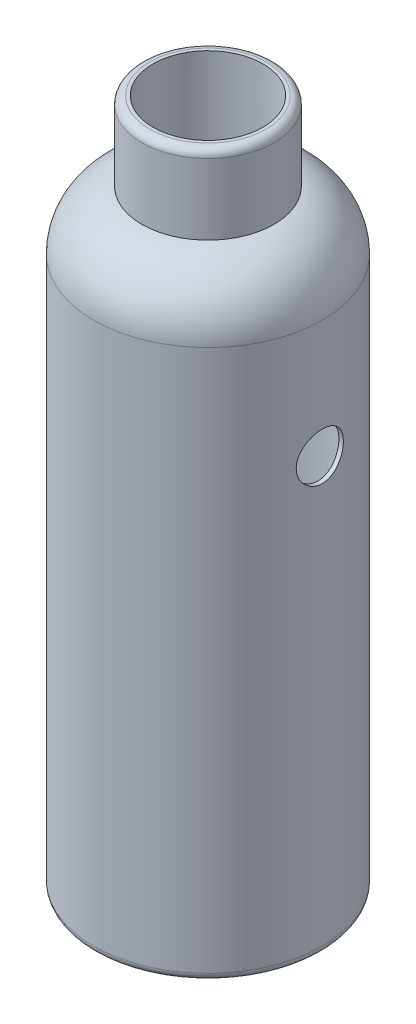
ISO-10303-21;
HEADER;
FILE_DESCRIPTION(('STEP AP214'),'2;1');
FILE_NAME('part.step','',(''),(''),'','','');
FILE_SCHEMA(('AUTOMOTIVE_DESIGN { 1 0 10303 214 1 1 1 1 }'));
ENDSEC;
DATA;
#1=APPLICATION_CONTEXT('core data for automotive mechanical design processes');
#2=APPLICATION_PROTOCOL_DEFINITION('international standard','automotive_design',2000,#1);
#3=PRODUCT_CONTEXT('',#1,'mechanical');
#4=PRODUCT('Part','Part','',(#3));
#5=PRODUCT_RELATED_PRODUCT_CATEGORY('part','',(#4));
#6=PRODUCT_DEFINITION_FORMATION('','',#4);
#7=PRODUCT_DEFINITION_CONTEXT('part definition',#1,'design');
#8=PRODUCT_DEFINITION('design','',#6,#7);
#9=PRODUCT_DEFINITION_SHAPE('','',#8);
#10=(LENGTH_UNIT() NAMED_UNIT(*) SI_UNIT(.MILLI.,.METRE.));
#11=(NAMED_UNIT(*) PLANE_ANGLE_UNIT() SI_UNIT($,.RADIAN.));
#12=(NAMED_UNIT(*) SI_UNIT($,.STERADIAN.) SOLID_ANGLE_UNIT());
#13=UNCERTAINTY_MEASURE_WITH_UNIT(LENGTH_MEASURE(1.E-05),#10,'distance_accuracy_value','');
#14=(GEOMETRIC_REPRESENTATION_CONTEXT(3) GLOBAL_UNCERTAINTY_ASSIGNED_CONTEXT((#13)) GLOBAL_UNIT_ASSIGNED_CONTEXT((#10,
#11,#12)) REPRESENTATION_CONTEXT('',''));
#15=CARTESIAN_POINT('',(0.,0.,0.));
#16=DIRECTION('',(0.,0.,1.));
#17=DIRECTION('',(1.,0.,0.));
#18=AXIS2_PLACEMENT_3D('',#15,#16,#17);
#19=CARTESIAN_POINT('',(0.,171.45,0.));
#20=DIRECTION('',(0.,-1.,0.));
#21=DIRECTION('',(0.,0.,-1.));
#22=AXIS2_PLACEMENT_3D('',#19,#20,#21);
#23=CYLINDRICAL_SURFACE('',#22,36.96335);
#24=CARTESIAN_POINT('',(0.,177.8,0.));
#25=DIRECTION('',(0.,1.,0.));
#26=DIRECTION('',(0.,0.,1.));
#27=AXIS2_PLACEMENT_3D('',#24,#25,#26);
#28=CIRCLE('',#27,36.96335);
#29=CARTESIAN_POINT('',(0.,177.8,36.96335));
#30=VERTEX_POINT('',#29);
#31=EDGE_CURVE('E60',#30,#30,#28,.F.);
#32=ORIENTED_EDGE('',*,*,#31,.T.);
#33=EDGE_LOOP('',(#32));
#34=FACE_BOUND('',#33,.T.);
#35=CARTESIAN_POINT('',(0.,2.53999999999999,0.));
#36=DIRECTION('',(0.,1.,0.));
#37=DIRECTION('',(0.,0.,1.));
#38=AXIS2_PLACEMENT_3D('',#35,#36,#37);
#39=CIRCLE('',#38,36.96335);
#40=CARTESIAN_POINT('',(0.,2.53999999999999,36.96335));
#41=VERTEX_POINT('',#40);
#42=EDGE_CURVE('E89',#41,#41,#39,.T.);
#43=ORIENTED_EDGE('',*,*,#42,.T.);
#44=EDGE_LOOP('',(#43));
#45=FACE_BOUND('',#44,.T.);
#46=CARTESIAN_POINT('',(36.96335,132.08,0.));
#47=CARTESIAN_POINT('',(36.963352305865,132.079995571433,-0.211679694230586));
#48=CARTESIAN_POINT('',(36.9615285466324,132.0888227045,-0.423304774462052));
#49=CARTESIAN_POINT('',(36.9542894645861,132.124051847075,-0.845088147981925));
#50=CARTESIAN_POINT('',(36.948873557214,132.15045671705,-1.05524619691118));
#51=CARTESIAN_POINT('',(36.9345947012524,132.220654137063,-1.4726167469524));
#52=CARTESIAN_POINT('',(36.9257300511885,132.264455269957,-1.67982774171632));
#53=CARTESIAN_POINT('',(36.904797440222,132.369116022692,-2.08981192735579));
#54=CARTESIAN_POINT('',(36.8927283016668,132.429981914311,-2.29258345700828));
#55=CARTESIAN_POINT('',(36.8657406258846,132.568199948135,-2.69191595729348));
#56=CARTESIAN_POINT('',(36.8508260197034,132.645529362686,-2.88848506506365));
#57=CARTESIAN_POINT('',(36.8185395774822,132.816176100357,-3.27443189100768));
#58=CARTESIAN_POINT('',(36.8011668350043,132.909499323889,-3.46380692354248));
#59=CARTESIAN_POINT('',(36.7644496021085,133.111392003192,-3.83393595534274));
#60=CARTESIAN_POINT('',(36.7451059820618,133.219954736885,-4.01469370881079));
#61=CARTESIAN_POINT('',(36.7049567919359,133.451638111737,-4.36655031555331));
#62=CARTESIAN_POINT('',(36.6841506692058,133.574764268254,-4.53764547300001));
#63=CARTESIAN_POINT('',(36.6413801655638,133.836319945789,-4.87104758866114));
#64=CARTESIAN_POINT('',(36.6194045932802,133.974920833495,-5.0332186939354));
#65=CARTESIAN_POINT('',(36.5751359204194,134.265267872421,-5.34542340850403));
#66=CARTESIAN_POINT('',(36.5528426797653,134.417019982652,-5.49545145542683));
#67=CARTESIAN_POINT('',(36.5085665911123,134.732606772109,-5.78228982257317));
#68=CARTESIAN_POINT('',(36.4865837691138,134.896442456374,-5.91909904114372));
#69=CARTESIAN_POINT('',(36.4435562254647,135.235011446827,-6.17848969631476));
#70=CARTESIAN_POINT('',(36.4225110839487,135.409739789785,-6.30107754107174));
#71=CARTESIAN_POINT('',(36.3817372908439,135.770819130733,-6.53240963172599));
#72=CARTESIAN_POINT('',(36.3620242026563,135.95727025002,-6.6410004276127));
#73=CARTESIAN_POINT('',(36.3247361318321,136.338804423867,-6.84202018975111));
#74=CARTESIAN_POINT('',(36.3071603287031,136.533884126488,-6.93445536405774));
#75=CARTESIAN_POINT('',(36.2746543695883,136.931433765533,-7.10253677391986));
#76=CARTESIAN_POINT('',(36.2597250277854,137.13390595323,-7.17817784457703));
#77=CARTESIAN_POINT('',(36.2329739215797,137.544650615105,-7.31201097166313));
#78=CARTESIAN_POINT('',(36.2211509157941,137.752920735345,-7.37020999975553));
#79=CARTESIAN_POINT('',(36.201102035388,138.170966815679,-7.46805980384476));
#80=CARTESIAN_POINT('',(36.1928296916109,138.380684353409,-7.50795069883898));
#81=CARTESIAN_POINT('',(36.1799034090434,138.802758954121,-7.56999599281672));
#82=CARTESIAN_POINT('',(36.1752481136092,139.015114997089,-7.59215704181422));
#83=CARTESIAN_POINT('',(36.1696914555439,139.441005574881,-7.61858559704948));
#84=CARTESIAN_POINT('',(36.1687904235639,139.654540211851,-7.62285152720195));
#85=CARTESIAN_POINT('',(36.1707706162093,140.081195599273,-7.61344990933926));
#86=CARTESIAN_POINT('',(36.1736518069281,140.294316353419,-7.59978252209136));
#87=CARTESIAN_POINT('',(36.1830317286498,140.715121774816,-7.55499629179603));
#88=CARTESIAN_POINT('',(36.1894708220917,140.922838464319,-7.52416508621805));
#89=CARTESIAN_POINT('',(36.2057389977795,141.334963483618,-7.44548982067689));
#90=CARTESIAN_POINT('',(36.2155692539433,141.539370642068,-7.39763986916152));
#91=CARTESIAN_POINT('',(36.2383312106017,141.943314704258,-7.28531897321399));
#92=CARTESIAN_POINT('',(36.2512618999493,142.142853172503,-7.22085344712181));
#93=CARTESIAN_POINT('',(36.2798623993763,142.535841669832,-7.07575386959306));
#94=CARTESIAN_POINT('',(36.2955332297409,142.729289399271,-6.99511379394992));
#95=CARTESIAN_POINT('',(36.3292832908999,143.110012075058,-6.81767008691363));
#96=CARTESIAN_POINT('',(36.3473781267145,143.297236291759,-6.72076059801996));
#97=CARTESIAN_POINT('',(36.3853905877638,143.662940424932,-6.51182524218756));
#98=CARTESIAN_POINT('',(36.4053088415862,143.841417293124,-6.39979415601234));
#99=CARTESIAN_POINT('',(36.4464082290524,144.188374544478,-6.16142763328717));
#100=CARTESIAN_POINT('',(36.4675892751894,144.3568556187,-6.03509318736222));
#101=CARTESIAN_POINT('',(36.5106345034388,144.68273840741,-5.7689665808631));
#102=CARTESIAN_POINT('',(36.5324986943878,144.840139978496,-5.62917424615917));
#103=CARTESIAN_POINT('',(36.576739872546,145.145765723836,-5.33422928329601));
#104=CARTESIAN_POINT('',(36.5991185988651,145.293753515833,-5.17883186289039));
#105=CARTESIAN_POINT('',(36.6433323072458,145.576087016594,-4.85612494645797));
#106=CARTESIAN_POINT('',(36.6651674702819,145.710437312953,-4.68881948867861));
#107=CARTESIAN_POINT('',(36.7076990515941,145.964666299789,-4.34331377554415));
#108=CARTESIAN_POINT('',(36.7283950279206,146.084539395046,-4.16510934772894));
#109=CARTESIAN_POINT('',(36.7680510810867,146.308851915944,-3.79914719300311));
#110=CARTESIAN_POINT('',(36.7870118181048,146.413297220514,-3.61139314193622));
#111=CARTESIAN_POINT('',(36.8227107402634,146.606243237669,-3.22715333462816));
#112=CARTESIAN_POINT('',(36.8394441088194,146.694709539136,-3.03064984364046));
#113=CARTESIAN_POINT('',(36.8701591323886,146.85471578782,-2.63074246955419));
#114=CARTESIAN_POINT('',(36.8841418024484,146.926261980775,-2.42734116445322));
#115=CARTESIAN_POINT('',(36.9089640157106,147.051909830788,-2.015012562268));
#116=CARTESIAN_POINT('',(36.9198033025124,147.106010064847,-1.80608481591681));
#117=CARTESIAN_POINT('',(36.9380245725384,147.196317455727,-1.3842497229082));
#118=CARTESIAN_POINT('',(36.945406612497,147.232524906173,-1.17134244161565));
#119=CARTESIAN_POINT('',(36.9564003485042,147.286261402962,-0.746968126951276));
#120=CARTESIAN_POINT('',(36.9600772276475,147.304113485097,-0.535543635240457));
#121=CARTESIAN_POINT('',(36.9637881598771,147.322130337452,-0.111834971871085));
#122=CARTESIAN_POINT('',(36.963820941936,147.32228893635,0.100449473914229));
#123=CARTESIAN_POINT('',(36.9602402454431,147.304905471858,0.524170780358944));
#124=CARTESIAN_POINT('',(36.9566283057164,147.287370878649,0.735607960914798));
#125=CARTESIAN_POINT('',(36.9458598573688,147.234744839862,1.15627369551296));
#126=CARTESIAN_POINT('',(36.9387020389765,147.199646906716,1.36550140423543));
#127=CARTESIAN_POINT('',(36.9211301115606,147.11261089259,1.77809077501895));
#128=CARTESIAN_POINT('',(36.9107493013978,147.06084482698,1.98149018474644));
#129=CARTESIAN_POINT('',(36.8869884767619,146.940755368956,2.38324024496402));
#130=CARTESIAN_POINT('',(36.8736073753735,146.872425975416,2.58158903669624));
#131=CARTESIAN_POINT('',(36.8442128980976,146.719742743786,2.97178354640628));
#132=CARTESIAN_POINT('',(36.8281998912083,146.635391151781,3.16363017145878));
#133=CARTESIAN_POINT('',(36.7939706559759,146.451267431915,3.53957628616298));
#134=CARTESIAN_POINT('',(36.7757543404414,146.351494693752,3.72367546883713));
#135=CARTESIAN_POINT('',(36.737360091282,146.135851190639,4.08522874080188));
#136=CARTESIAN_POINT('',(36.7171599049891,146.019789553152,4.26256663149082));
#137=CARTESIAN_POINT('',(36.6755511870607,145.773380684941,4.60687142566143));
#138=CARTESIAN_POINT('',(36.654142646965,145.643033354189,4.77383825651347));
#139=CARTESIAN_POINT('',(36.6106987524419,145.368926529652,5.09631815849098));
#140=CARTESIAN_POINT('',(36.588663327841,145.225165530201,5.25182994028919));
#141=CARTESIAN_POINT('',(36.5445705964063,144.925208013297,5.55034894525217));
#142=CARTESIAN_POINT('',(36.522513289896,144.769011677092,5.69335635060737));
#143=CARTESIAN_POINT('',(36.4786235268506,144.442543265155,5.96816163415035));
#144=CARTESIAN_POINT('',(36.4568007571416,144.27208172949,6.09973609472135));
#145=CARTESIAN_POINT('',(36.4143911027815,143.920598760597,6.34800947647873));
#146=CARTESIAN_POINT('',(36.3938037677416,143.739581223695,6.46471383634008));
#147=CARTESIAN_POINT('',(36.354445373317,143.368101958783,6.68249955524734));
#148=CARTESIAN_POINT('',(36.3356749613482,143.177636900676,6.78357535304727));
#149=CARTESIAN_POINT('',(36.3005173522798,142.788721369961,6.9692621385253));
#150=CARTESIAN_POINT('',(36.2841292219219,142.590274063506,7.0538795781762));
#151=CARTESIAN_POINT('',(36.2542912963858,142.187744110631,7.20566184857599));
#152=CARTESIAN_POINT('',(36.2408271298436,141.983694847854,7.27291236199792));
#153=CARTESIAN_POINT('',(36.2171406769159,141.570547056419,7.38996164715036));
#154=CARTESIAN_POINT('',(36.2069171771001,141.361450449317,7.43976695177269));
#155=CARTESIAN_POINT('',(36.1900144993639,140.939643012869,7.52155841477984));
#156=CARTESIAN_POINT('',(36.1833355667087,140.726931934472,7.55354334009641));
#157=CARTESIAN_POINT('',(36.1737276923175,140.299484549272,7.59942235713462));
#158=CARTESIAN_POINT('',(36.1707986935403,140.084748273326,7.61331672403639));
#159=CARTESIAN_POINT('',(36.1688000871534,139.659048561393,7.62280552684672));
#160=CARTESIAN_POINT('',(36.1696563186839,139.448093228755,7.61875160623648));
#161=CARTESIAN_POINT('',(36.1750354209337,139.027217629738,7.59316970556277));
#162=CARTESIAN_POINT('',(36.1795595644802,138.817297748124,7.57163565959844));
#163=CARTESIAN_POINT('',(36.1921400572037,138.400150249136,7.51127078315852));
#164=CARTESIAN_POINT('',(36.2001950681268,138.192921642337,7.47244650586131));
#165=CARTESIAN_POINT('',(36.2196044392257,137.782463372477,7.37779296054628));
#166=CARTESIAN_POINT('',(36.2309600229952,137.579235222359,7.3219573857011));
#167=CARTESIAN_POINT('',(36.2566017106989,137.178865002514,7.19390865321248));
#168=CARTESIAN_POINT('',(36.2708790347766,136.98170668878,7.12174449599648));
#169=CARTESIAN_POINT('',(36.3019787602916,136.594178301651,6.96148256158658));
#170=CARTESIAN_POINT('',(36.3188012519349,136.403808469149,6.87338421963034));
#171=CARTESIAN_POINT('',(36.3545197834538,136.031120302254,6.68188718233762));
#172=CARTESIAN_POINT('',(36.3734159237194,135.848802358272,6.57848774615545));
#173=CARTESIAN_POINT('',(36.412758574028,135.493417232364,6.35711331736388));
#174=CARTESIAN_POINT('',(36.4332051072389,135.320350188742,6.23913810692922));
#175=CARTESIAN_POINT('',(36.4754684836294,134.981555445218,5.9871570440038));
#176=CARTESIAN_POINT('',(36.497303394242,134.816016495924,5.85290037055428));
#177=CARTESIAN_POINT('',(36.5413901650006,134.496794403743,5.57103135429851));
#178=CARTESIAN_POINT('',(36.5636420207452,134.343111135791,5.42341915241331));
#179=CARTESIAN_POINT('',(36.6079546131147,134.048565601184,5.11576577547076));
#180=CARTESIAN_POINT('',(36.6300152653213,133.907708760233,4.95571939319594));
#181=CARTESIAN_POINT('',(36.6733175464771,133.639897877082,4.62438350718101));
#182=CARTESIAN_POINT('',(36.6945594726417,133.512938758313,4.45309814563627));
#183=CARTESIAN_POINT('',(36.7358855374174,133.272352227471,4.09831826246546));
#184=CARTESIAN_POINT('',(36.7559533031213,133.158897377497,3.91470474307383));
#185=CARTESIAN_POINT('',(36.7940826445639,132.947930878589,3.5384278191961));
#186=CARTESIAN_POINT('',(36.8121449584917,132.850413356984,3.34576778205859));
#187=CARTESIAN_POINT('',(36.8457476389856,132.672059169958,2.95279008985208));
#188=CARTESIAN_POINT('',(36.8612894823975,132.591212728679,2.75247700465884));
#189=CARTESIAN_POINT('',(36.8894167725781,132.446778351097,2.34559123408765));
#190=CARTESIAN_POINT('',(36.9020027754258,132.38318716823,2.13901973436738));
#191=CARTESIAN_POINT('',(36.9293583177609,132.246189003972,1.61571585991906));
#192=CARTESIAN_POINT('',(36.9420375975474,132.183955559866,1.29587623195638));
#193=CARTESIAN_POINT('',(36.9590315184121,132.100865195828,0.650647955752249));
#194=CARTESIAN_POINT('',(36.9633464568897,132.08000680478,0.325259505217649));
#195=CARTESIAN_POINT('',(36.96335,132.08,0.));
#196=B_SPLINE_CURVE_WITH_KNOTS('',3,(#46,#47,#48,#49,#50,#51,#52,#53,#54,#55,#56,#57,#58,#59,
#60,#61,#62,#63,#64,#65,#66,#67,#68,#69,#70,#71,#72,#73,#74,#75,#76,#77,#78,#79,#80,#81,#82,#83,
#84,#85,#86,#87,#88,#89,#90,#91,#92,#93,#94,#95,#96,#97,#98,#99,#100,#101,#102,#103,#104,#105,
#106,#107,#108,#109,#110,#111,#112,#113,#114,#115,#116,#117,#118,#119,#120,#121,#122,#123,#124,
#125,#126,#127,#128,#129,#130,#131,#132,#133,#134,#135,#136,#137,#138,#139,#140,#141,#142,#143,
#144,#145,#146,#147,#148,#149,#150,#151,#152,#153,#154,#155,#156,#157,#158,#159,#160,#161,#162,
#163,#164,#165,#166,#167,#168,#169,#170,#171,#172,#173,#174,#175,#176,#177,#178,#179,#180,#181,
#182,#183,#184,#185,#186,#187,#188,#189,#190,#191,#192,#193,#194,#195),.UNSPECIFIED.,.T.,.F.,(4,
2,2,2,2,2,2,2,2,2,2,2,2,2,2,2,2,2,2,2,2,2,2,2,2,2,2,2,2,2,2,2,2,2,2,2,2,2,2,2,2,2,2,2,2,2,2,2,2,
2,2,2,2,2,2,2,2,2,2,2,2,2,2,2,2,2,2,2,2,2,2,2,2,2,4),(0.,0.634753368016072,1.26961005625481,
1.90478035590442,2.54018440512846,3.17471691100157,3.80948401354166,4.44397199792732,
5.07870104527737,5.72132856199586,6.36424880051057,7.00722257366469,7.64990548790905,
8.29912375899259,8.94809200648656,9.59725956359522,10.2461672983613,10.8863023796074,
11.5261972497669,12.1661484765073,12.8060939663006,13.4356245267396,14.0653732306259,
14.6949168326718,15.3246953449128,15.9587427311102,16.5930095217727,17.2272324110975,
17.8614635076479,18.5079613651921,19.1542410178096,19.8007696538893,20.4470512840573,
21.0947085193067,21.7421263097103,22.3895968940876,23.0370568529247,23.6729163423884,
24.3089976130389,24.9448104383666,25.5808582946028,26.2105418979347,26.8404539863244,
27.4702778350474,28.100126615881,28.7380916526498,29.3760611566518,30.0141023581688,
30.6521342617905,31.3006747266761,31.9489773056278,32.5975100473932,33.2457880379551,
33.8908037474137,34.5355776521248,35.1803961659606,35.8252048711819,36.4574369685961,
37.089888555141,37.7221006396564,38.3545473984814,38.9851208440674,39.6157166437267,
40.2463429854583,40.8769787526218,41.5189923790345,42.1609992320208,42.8032764107308,
43.4453181895653,44.0948404057635,44.7441227403717,45.3930232487613,46.0418015822473,
47.0171757595428,47.9925152561656),.UNSPECIFIED.);
#197=CARTESIAN_POINT('',(36.96335,132.08,0.));
#198=VERTEX_POINT('',#197);
#199=EDGE_CURVE('E73',#198,#198,#196,.T.);
#200=ORIENTED_EDGE('',*,*,#199,.F.);
#201=EDGE_LOOP('',(#200));
#202=FACE_BOUND('',#201,.T.);
#203=ADVANCED_FACE('F42',(#34,#45,#202),#23,.T.);
#204=CARTESIAN_POINT('',(0.,171.958,0.));
#205=DIRECTION('',(0.,-1.,0.));
#206=DIRECTION('',(0.,0.,-1.));
#207=AXIS2_PLACEMENT_3D('',#204,#205,#206);
#208=CYLINDRICAL_SURFACE('',#207,35.56);
#209=CARTESIAN_POINT('',(0.,177.8,0.));
#210=DIRECTION('',(0.,-1.,0.));
#211=DIRECTION('',(0.,0.,-1.));
#212=AXIS2_PLACEMENT_3D('',#209,#210,#211);
#213=CIRCLE('',#212,35.56);
#214=CARTESIAN_POINT('',(0.,177.8,-35.56));
#215=VERTEX_POINT('',#214);
#216=EDGE_CURVE('E66',#215,#215,#213,.T.);
#217=ORIENTED_EDGE('',*,*,#216,.F.);
#218=EDGE_LOOP('',(#217));
#219=FACE_BOUND('',#218,.T.);
#220=CARTESIAN_POINT('',(0.,0.508000000000008,0.));
#221=DIRECTION('',(0.,1.,0.));
#222=DIRECTION('',(0.,0.,1.));
#223=AXIS2_PLACEMENT_3D('',#220,#221,#222);
#224=CIRCLE('',#223,35.56);
#225=CARTESIAN_POINT('',(0.,0.508000000000008,35.56));
#226=VERTEX_POINT('',#225);
#227=EDGE_CURVE('E65',#226,#226,#224,.T.);
#228=ORIENTED_EDGE('',*,*,#227,.F.);
#229=EDGE_LOOP('',(#228));
#230=FACE_BOUND('',#229,.T.);
#231=CARTESIAN_POINT('',(34.7339776011905,139.7,7.61999999999999));
#232=CARTESIAN_POINT('',(34.7339748405592,139.488573420938,7.62000474434297));
#233=CARTESIAN_POINT('',(34.735911539175,139.277203893653,7.61119848755288));
#234=CARTESIAN_POINT('',(34.743594345941,138.855934623121,7.57605478530873));
#235=CARTESIAN_POINT('',(34.7493410440632,138.646035112591,7.54971462475628));
#236=CARTESIAN_POINT('',(34.7644797716168,138.229190753805,7.47969373336143));
#237=CARTESIAN_POINT('',(34.7738735072433,138.022247335548,7.43600488605704));
#238=CARTESIAN_POINT('',(34.7960314699956,137.612798675343,7.33161921072208));
#239=CARTESIAN_POINT('',(34.8087969392712,137.410295098873,7.27091611412155));
#240=CARTESIAN_POINT('',(34.8373028922588,137.011510268028,7.13308257664017));
#241=CARTESIAN_POINT('',(34.8530390027086,136.815220355989,7.05597626302394));
#242=CARTESIAN_POINT('',(34.8870526622298,136.429815351821,6.88583188973392));
#243=CARTESIAN_POINT('',(34.9053311493812,136.240702940964,6.79278794648545));
#244=CARTESIAN_POINT('',(34.9439000142839,135.87106722386,6.59150530631687));
#245=CARTESIAN_POINT('',(34.9641895395187,135.690540325678,6.48327303998726));
#246=CARTESIAN_POINT('',(35.0062301996411,135.339104933884,6.25229767853434));
#247=CARTESIAN_POINT('',(35.0279818876644,135.168200125746,6.12954907840137));
#248=CARTESIAN_POINT('',(35.0726568071681,134.834845529242,5.86856985204243));
#249=CARTESIAN_POINT('',(35.0955922633621,134.672549659394,5.73014467707557));
#250=CARTESIAN_POINT('',(35.1417144465293,134.360075848034,5.44013491391337));
#251=CARTESIAN_POINT('',(35.1649012832634,134.209903463403,5.28854435661704));
#252=CARTESIAN_POINT('',(35.2108740774999,133.922756231083,4.9732606717355));
#253=CARTESIAN_POINT('',(35.2336600032762,133.78578242406,4.80956659162153));
#254=CARTESIAN_POINT('',(35.2781883355924,133.52604334816,4.47125470005719));
#255=CARTESIAN_POINT('',(35.2999312102501,133.403271669829,4.29664187150869));
#256=CARTESIAN_POINT('',(35.342003591514,133.171512773294,3.93569989310303));
#257=CARTESIAN_POINT('',(35.3623158071617,133.062684295075,3.74926674310909));
#258=CARTESIAN_POINT('',(35.4006883065756,132.861190475575,3.36773043338269));
#259=CARTESIAN_POINT('',(35.4187494563567,132.768518913008,3.1726306472461));
#260=CARTESIAN_POINT('',(35.4521192823778,132.59997241032,2.77500453499058));
#261=CARTESIAN_POINT('',(35.4674271126425,132.524102631007,2.57247594925855));
#262=CARTESIAN_POINT('',(35.4948379144093,132.389826205077,2.16158596867104));
#263=CARTESIAN_POINT('',(35.5069421711172,132.331412554212,1.95322695006943));
#264=CARTESIAN_POINT('',(35.5274517855911,132.233213326309,1.53522325144428));
#265=CARTESIAN_POINT('',(35.5359088670414,132.193166713816,1.32564241843643));
#266=CARTESIAN_POINT('',(35.5491379391554,132.130790057358,0.903824013243305));
#267=CARTESIAN_POINT('',(35.5539113150018,132.108453353855,0.691587470221662));
#268=CARTESIAN_POINT('',(35.559642821628,132.081655721438,0.265918696309676));
#269=CARTESIAN_POINT('',(35.5606006189176,132.077196355044,0.0524863625370755));
#270=CARTESIAN_POINT('',(35.5586727233026,132.086195074628,-0.373981735131165));
#271=CARTESIAN_POINT('',(35.5557870649518,132.099652999524,-0.587017502574809));
#272=CARTESIAN_POINT('',(35.5463335717759,132.144003137756,-1.00761508283507));
#273=CARTESIAN_POINT('',(35.53982742486,132.174603328613,-1.21520915629251));
#274=CARTESIAN_POINT('',(35.5233531966381,132.252793689856,-1.62710679422538));
#275=CARTESIAN_POINT('',(35.5133839172104,132.30038974037,-1.83140919426823));
#276=CARTESIAN_POINT('',(35.4902597175457,132.412179940001,-2.23516068839963));
#277=CARTESIAN_POINT('',(35.4771058563629,132.476368571622,-2.43461137174363));
#278=CARTESIAN_POINT('',(35.4479615301771,132.620890999263,-2.82744300123553));
#279=CARTESIAN_POINT('',(35.4319700088183,132.701230809253,-3.02082165533058));
#280=CARTESIAN_POINT('',(35.3974681837783,132.878041461549,-3.40141214661453));
#281=CARTESIAN_POINT('',(35.3789417064679,132.974616877535,-3.58857392588548));
#282=CARTESIAN_POINT('',(35.3399476004349,133.182856747237,-3.95417724378021));
#283=CARTESIAN_POINT('',(35.3194793024389,133.294526409054,-4.13261574346902));
#284=CARTESIAN_POINT('',(35.2771595158106,133.532144183109,-4.47952612730955));
#285=CARTESIAN_POINT('',(35.2553081127379,133.65809141251,-4.64799862671744));
#286=CARTESIAN_POINT('',(35.2108077655562,133.923419387529,-4.9738989527868));
#287=CARTESIAN_POINT('',(35.1881588100136,134.062800325783,-5.13132662101174));
#288=CARTESIAN_POINT('',(35.1422130506564,134.357016878314,-5.43717391947518));
#289=CARTESIAN_POINT('',(35.1189123961349,134.512107588414,-5.5853476877156));
#290=CARTESIAN_POINT('',(35.0727777559854,134.834208190621,-5.86808121326542));
#291=CARTESIAN_POINT('',(35.0499436160662,135.001214057147,-6.00264553177985));
#292=CARTESIAN_POINT('',(35.0053719793077,135.346137541407,-6.25733639831589));
#293=CARTESIAN_POINT('',(34.9836349198727,135.524059449682,-6.37745721371244));
#294=CARTESIAN_POINT('',(34.9418991673334,135.889482174612,-6.60229943347416));
#295=CARTESIAN_POINT('',(34.9218998128285,136.076979303245,-6.70702670747978));
#296=CARTESIAN_POINT('',(34.8841528753718,136.460937032021,-6.90066994654408));
#297=CARTESIAN_POINT('',(34.8664125888833,136.657424022822,-6.98953503260883));
#298=CARTESIAN_POINT('',(34.833792083198,137.057355547436,-7.15033302449804));
#299=CARTESIAN_POINT('',(34.8189108037947,137.260797469055,-7.22227220919158));
#300=CARTESIAN_POINT('',(34.7924490991892,137.673261695886,-7.34869112402216));
#301=CARTESIAN_POINT('',(34.780868884059,137.882284355318,-7.40316974303746));
#302=CARTESIAN_POINT('',(34.7613660306907,138.304362732782,-7.49421133766492));
#303=CARTESIAN_POINT('',(34.7534433239837,138.517418375239,-7.53077464865435));
#304=CARTESIAN_POINT('',(34.7416189186641,138.941732849553,-7.58513499041118));
#305=CARTESIAN_POINT('',(34.7376408056795,139.152943902954,-7.60328881279313));
#306=CARTESIAN_POINT('',(34.7335530182392,139.576257083317,-7.62194119163468));
#307=CARTESIAN_POINT('',(34.7334446923309,139.788359495149,-7.62243359342464));
#308=CARTESIAN_POINT('',(34.7371024647475,140.211742421553,-7.6057467869457));
#309=CARTESIAN_POINT('',(34.7408669040474,140.423023249174,-7.5885751456457));
#310=CARTESIAN_POINT('',(34.7521567288913,140.843399437937,-7.53670390496975));
#311=CARTESIAN_POINT('',(34.7596835048691,141.052493961907,-7.50199782540159));
#312=CARTESIAN_POINT('',(34.7781652541976,141.464494282841,-7.4158435178257));
#313=CARTESIAN_POINT('',(34.7890791915545,141.667443827301,-7.36459541610791));
#314=CARTESIAN_POINT('',(34.81405139936,142.068336155334,-7.24562744147216));
#315=CARTESIAN_POINT('',(34.8281108071853,142.266277098946,-7.17790160956363));
#316=CARTESIAN_POINT('',(34.8589695185587,142.655712044854,-7.02650742061891));
#317=CARTESIAN_POINT('',(34.8757684687817,142.847206874683,-6.94284111922744));
#318=CARTESIAN_POINT('',(34.9116374168006,143.222517274936,-6.76016511182205));
#319=CARTESIAN_POINT('',(34.9307075094657,143.406332524137,-6.66115476481051));
#320=CARTESIAN_POINT('',(34.9708877642823,143.767741627653,-6.44691071410753));
#321=CARTESIAN_POINT('',(34.9920239503117,143.945203079489,-6.33145852023191));
#322=CARTESIAN_POINT('',(35.0355014163815,144.289812991894,-6.08627440564554));
#323=CARTESIAN_POINT('',(35.0578427060602,144.456961369956,-5.95654237071719));
#324=CARTESIAN_POINT('',(35.1031154191717,144.779869674253,-5.6836618804217));
#325=CARTESIAN_POINT('',(35.1260469110187,144.935628272115,-5.54051186456447));
#326=CARTESIAN_POINT('',(35.1718689668363,145.234709548299,-5.24176170060401));
#327=CARTESIAN_POINT('',(35.1947595313951,145.378032406755,-5.08616173290276));
#328=CARTESIAN_POINT('',(35.2402844826533,145.653761581443,-4.76061353233401));
#329=CARTESIAN_POINT('',(35.2629067775943,145.785924011341,-4.59045692795719));
#330=CARTESIAN_POINT('',(35.3068175377795,146.035395964562,-4.23951532920945));
#331=CARTESIAN_POINT('',(35.3281064891676,146.152710917465,-4.05873425572511));
#332=CARTESIAN_POINT('',(35.368766286461,146.371732697794,-3.68765714900782));
#333=CARTESIAN_POINT('',(35.3881364535229,146.473434008243,-3.49735778389462));
#334=CARTESIAN_POINT('',(35.424393326622,146.660377329479,-3.10870202116115));
#335=CARTESIAN_POINT('',(35.4412810095177,146.74562581861,-2.91034883214772));
#336=CARTESIAN_POINT('',(35.4720088848729,146.898597003256,-2.50811200352209));
#337=CARTESIAN_POINT('',(35.4858664710188,146.9664201413,-2.30426790198227));
#338=CARTESIAN_POINT('',(35.5102613477292,147.084633242444,-1.89147217029623));
#339=CARTESIAN_POINT('',(35.5207998843085,147.135029748428,-1.68252248867274));
#340=CARTESIAN_POINT('',(35.5382626246819,147.218015581503,-1.26095086123416));
#341=CARTESIAN_POINT('',(35.5451865737097,147.250603653413,-1.04832865766017));
#342=CARTESIAN_POINT('',(35.555219427342,147.297694386773,-0.62100249155921));
#343=CARTESIAN_POINT('',(35.5583283911894,147.312197329066,-0.406298561411557));
#344=CARTESIAN_POINT('',(35.5606185484792,147.322887636721,0.0192523481972831));
#345=CARTESIAN_POINT('',(35.5598776216467,147.319438160597,0.230089873790791));
#346=CARTESIAN_POINT('',(35.5546670554091,147.295083344367,0.650782069085339));
#347=CARTESIAN_POINT('',(35.5501961224879,147.274171948699,0.860636372426743));
#348=CARTESIAN_POINT('',(35.5376502664912,147.215066077714,1.27770312079087));
#349=CARTESIAN_POINT('',(35.5295767340327,147.176878271077,1.48491655348581));
#350=CARTESIAN_POINT('',(35.5100452575098,147.083508423065,1.89539516393831));
#351=CARTESIAN_POINT('',(35.4985860589703,147.028320082237,2.09865884840896));
#352=CARTESIAN_POINT('',(35.4726404951617,146.90158696017,2.49910166996573));
#353=CARTESIAN_POINT('',(35.4581639298418,146.830095061351,2.69629818950751));
#354=CARTESIAN_POINT('',(35.4265529185366,146.671191499569,3.0839541689048));
#355=CARTESIAN_POINT('',(35.4094183775604,146.583779267625,3.27441338768311));
#356=CARTESIAN_POINT('',(35.3729511750504,146.393666715863,3.64733209781487));
#357=CARTESIAN_POINT('',(35.3536184047873,146.290965639748,3.82979119284569));
#358=CARTESIAN_POINT('',(35.3132713852366,146.070998431905,4.18551213299489));
#359=CARTESIAN_POINT('',(35.2922571101336,145.95373207655,4.35877383684284));
#360=CARTESIAN_POINT('',(35.2487104043116,145.703155893348,4.69806401631569));
#361=CARTESIAN_POINT('',(35.2261572214904,145.569591626344,4.86390196745043));
#362=CARTESIAN_POINT('',(35.1805078251034,145.289103019196,5.18378020408911));
#363=CARTESIAN_POINT('',(35.1574116165537,145.142178802424,5.33782059851283));
#364=CARTESIAN_POINT('',(35.1113034320319,144.835888817714,5.63314496663117));
#365=CARTESIAN_POINT('',(35.08829149639,144.676517746047,5.77442344643818));
#366=CARTESIAN_POINT('',(35.0430100476972,144.346509650382,6.04314583548437));
#367=CARTESIAN_POINT('',(35.0207402667255,144.175876759727,6.17059477556482));
#368=CARTESIAN_POINT('',(34.9772757277637,143.822114177027,6.41241597623475));
#369=CARTESIAN_POINT('',(34.9560989180055,143.638849847836,6.52659462819449));
#370=CARTESIAN_POINT('',(34.9157658068594,143.263195215402,6.7390346396908));
#371=CARTESIAN_POINT('',(34.8966087621902,143.070808307356,6.83730186187838));
#372=CARTESIAN_POINT('',(34.8608841915436,142.678287945715,7.01717672080512));
#373=CARTESIAN_POINT('',(34.8443152006638,142.47815895496,7.09879379000877));
#374=CARTESIAN_POINT('',(34.8142543996272,142.071551594033,7.24477903034407));
#375=CARTESIAN_POINT('',(34.8007620267702,141.865074392774,7.30915035602583));
#376=CARTESIAN_POINT('',(34.7711217027322,141.337810357356,7.44918224915598));
#377=CARTESIAN_POINT('',(34.7572743442973,141.01370737168,7.51314502204836));
#378=CARTESIAN_POINT('',(34.7387046514647,140.359689816447,7.59854924230206));
#379=CARTESIAN_POINT('',(34.733981907123,140.029775508649,7.61999259994592));
#380=CARTESIAN_POINT('',(34.7339776011905,139.7,7.61999999999999));
#381=B_SPLINE_CURVE_WITH_KNOTS('',3,(#231,#232,#233,#234,#235,#236,#237,#238,#239,#240,#241,
#242,#243,#244,#245,#246,#247,#248,#249,#250,#251,#252,#253,#254,#255,#256,#257,#258,#259,#260,
#261,#262,#263,#264,#265,#266,#267,#268,#269,#270,#271,#272,#273,#274,#275,#276,#277,#278,#279,
#280,#281,#282,#283,#284,#285,#286,#287,#288,#289,#290,#291,#292,#293,#294,#295,#296,#297,#298,
#299,#300,#301,#302,#303,#304,#305,#306,#307,#308,#309,#310,#311,#312,#313,#314,#315,#316,#317,
#318,#319,#320,#321,#322,#323,#324,#325,#326,#327,#328,#329,#330,#331,#332,#333,#334,#335,#336,
#337,#338,#339,#340,#341,#342,#343,#344,#345,#346,#347,#348,#349,#350,#351,#352,#353,#354,#355,
#356,#357,#358,#359,#360,#361,#362,#363,#364,#365,#366,#367,#368,#369,#370,#371,#372,#373,#374,
#375,#376,#377,#378,#379,#380),.UNSPECIFIED.,.T.,.F.,(4,2,2,2,2,2,2,2,2,2,2,2,2,2,2,2,2,2,2,2,2,
2,2,2,2,2,2,2,2,2,2,2,2,2,2,2,2,2,2,2,2,2,2,2,2,2,2,2,2,2,2,2,2,2,2,2,2,2,2,2,2,2,2,2,2,2,2,2,2,
2,2,2,2,2,4),(0.,0.633989491145163,1.26807717744449,1.90246186740826,2.53708059202505,
3.17077224024913,3.8046983298132,4.43835682641287,5.07225639973238,5.71512856098136,
6.358293733436,7.001509575992,7.6444339918066,8.29412748210398,8.94357025010178,
9.59321222400154,10.2425931788763,10.8824349391752,11.5220359825649,12.161692927286,
12.8013441213447,13.4304162845406,14.0597063016302,14.6887873308172,15.3181030367167,
15.951639430939,16.5853949804635,17.2191113638418,17.8528368359335,18.4993496563843,
19.1456450750838,19.7921961675324,20.438500083428,21.0868411991675,21.7349414243314,
22.3830828838603,23.0312122096196,23.6665252820603,24.30205974689,24.9373220731374,
25.5728193448386,26.2008996814431,26.8292074949193,27.4574343381017,28.0856874325426,
28.7232420631873,29.3608017936964,29.9984357636148,30.6360604957779,31.2852002109004,
31.934101851767,32.5832322525898,33.232106532621,33.8771521461391,34.5219553116105,
35.1668039185035,35.8116425114152,36.4434880373095,37.0755527699014,37.7073737339005,
38.3394290978184,38.9694627665838,39.5995189567467,40.2296063244323,40.8597033673592,
41.5013373497022,42.1429654075082,42.7848683769314,43.4265370496747,44.0766284888235,
44.7264798505633,45.3759620369072,46.0253253402863,47.014243581424,48.0031173921282),.UNSPECIFIED.);
#382=CARTESIAN_POINT('',(34.7339776011905,139.7,7.61999999999999));
#383=VERTEX_POINT('',#382);
#384=EDGE_CURVE('E46',#383,#383,#381,.T.);
#385=ORIENTED_EDGE('',*,*,#384,.T.);
#386=EDGE_LOOP('',(#385));
#387=FACE_BOUND('',#386,.T.);
#388=ADVANCED_FACE('F125',(#219,#230,#387),#208,.F.);
#389=CARTESIAN_POINT('',(0.,0.,0.));
#390=DIRECTION('',(0.,1.,0.));
#391=DIRECTION('',(0.,0.,1.));
#392=AXIS2_PLACEMENT_3D('',#389,#390,#391);
#393=PLANE('',#392);
#394=CARTESIAN_POINT('',(0.,0.,0.));
#395=DIRECTION('',(0.,1.,0.));
#396=DIRECTION('',(0.,0.,1.));
#397=AXIS2_PLACEMENT_3D('',#394,#395,#396);
#398=CIRCLE('',#397,34.42335);
#399=CARTESIAN_POINT('',(0.,0.,34.42335));
#400=VERTEX_POINT('',#399);
#401=EDGE_CURVE('E92',#400,#400,#398,.F.);
#402=ORIENTED_EDGE('',*,*,#401,.T.);
#403=EDGE_LOOP('',(#402));
#404=FACE_BOUND('',#403,.T.);
#405=ADVANCED_FACE('F129',(#404),#393,.F.);
#406=CARTESIAN_POINT('',(0.,2.53999999999999,0.));
#407=DIRECTION('',(0.,1.,0.));
#408=DIRECTION('',(0.,0.,1.));
#409=AXIS2_PLACEMENT_3D('',#406,#407,#408);
#410=TOROIDAL_SURFACE('',#409,34.42335,2.54);
#411=ORIENTED_EDGE('',*,*,#401,.F.);
#412=EDGE_LOOP('',(#411));
#413=FACE_BOUND('',#412,.T.);
#414=ORIENTED_EDGE('',*,*,#42,.F.);
#415=EDGE_LOOP('',(#414));
#416=FACE_BOUND('',#415,.T.);
#417=ADVANCED_FACE('F106',(#413,#416),#410,.T.);
#418=CARTESIAN_POINT('',(0.,177.8,0.));
#419=DIRECTION('',(0.,1.,0.));
#420=DIRECTION('',(0.,0.,1.));
#421=AXIS2_PLACEMENT_3D('',#418,#419,#420);
#422=DEGENERATE_TOROIDAL_SURFACE('',#421,17.91335,19.05,.T.);
#423=ORIENTED_EDGE('',*,*,#31,.F.);
#424=EDGE_LOOP('',(#423));
#425=FACE_BOUND('',#424,.T.);
#426=CARTESIAN_POINT('',(0.,196.85,0.));
#427=DIRECTION('',(0.,1.,0.));
#428=DIRECTION('',(0.,0.,1.));
#429=AXIS2_PLACEMENT_3D('',#426,#427,#428);
#430=CIRCLE('',#429,17.91335);
#431=CARTESIAN_POINT('',(0.,196.85,17.91335));
#432=VERTEX_POINT('',#431);
#433=EDGE_CURVE('E95',#432,#432,#430,.T.);
#434=ORIENTED_EDGE('',*,*,#433,.F.);
#435=EDGE_LOOP('',(#434));
#436=FACE_BOUND('',#435,.T.);
#437=ADVANCED_FACE('F102',(#425,#436),#422,.T.);
#438=CARTESIAN_POINT('',(0.,222.25,0.));
#439=DIRECTION('',(0.,-1.,0.));
#440=DIRECTION('',(0.,0.,-1.));
#441=AXIS2_PLACEMENT_3D('',#438,#439,#440);
#442=CYLINDRICAL_SURFACE('',#441,21.36775);
#443=CARTESIAN_POINT('',(0.,219.71,0.));
#444=DIRECTION('',(0.,1.,0.));
#445=DIRECTION('',(0.,0.,1.));
#446=AXIS2_PLACEMENT_3D('',#443,#444,#445);
#447=CIRCLE('',#446,21.36775);
#448=CARTESIAN_POINT('',(0.,219.71,21.36775));
#449=VERTEX_POINT('',#448);
#450=EDGE_CURVE('E10',#449,#449,#447,.F.);
#451=ORIENTED_EDGE('',*,*,#450,.T.);
#452=EDGE_LOOP('',(#451));
#453=FACE_BOUND('',#452,.T.);
#454=CARTESIAN_POINT('',(0.,196.85,0.));
#455=DIRECTION('',(0.,1.,0.));
#456=DIRECTION('',(0.,0.,1.));
#457=AXIS2_PLACEMENT_3D('',#454,#455,#456);
#458=CIRCLE('',#457,21.36775);
#459=CARTESIAN_POINT('',(0.,196.85,21.36775));
#460=VERTEX_POINT('',#459);
#461=EDGE_CURVE('E86',#460,#460,#458,.T.);
#462=ORIENTED_EDGE('',*,*,#461,.T.);
#463=EDGE_LOOP('',(#462));
#464=FACE_BOUND('',#463,.T.);
#465=ADVANCED_FACE('F105',(#453,#464),#442,.T.);
#466=CARTESIAN_POINT('',(0.,222.25,0.));
#467=DIRECTION('',(0.,1.,0.));
#468=DIRECTION('',(0.,0.,1.));
#469=AXIS2_PLACEMENT_3D('',#466,#467,#468);
#470=PLANE('',#469);
#471=CARTESIAN_POINT('',(0.,222.25,0.));
#472=DIRECTION('',(0.,1.,0.));
#473=DIRECTION('',(0.,0.,1.));
#474=AXIS2_PLACEMENT_3D('',#471,#472,#473);
#475=CIRCLE('',#474,17.78);
#476=CARTESIAN_POINT('',(0.,222.25,17.78));
#477=VERTEX_POINT('',#476);
#478=EDGE_CURVE('E70',#477,#477,#475,.T.);
#479=ORIENTED_EDGE('',*,*,#478,.F.);
#480=EDGE_LOOP('',(#479));
#481=FACE_BOUND('',#480,.T.);
#482=CARTESIAN_POINT('',(0.,222.25,0.));
#483=DIRECTION('',(0.,1.,0.));
#484=DIRECTION('',(0.,0.,1.));
#485=AXIS2_PLACEMENT_3D('',#482,#483,#484);
#486=CIRCLE('',#485,18.82775);
#487=CARTESIAN_POINT('',(0.,222.25,18.82775));
#488=VERTEX_POINT('',#487);
#489=EDGE_CURVE('E55',#488,#488,#486,.T.);
#490=ORIENTED_EDGE('',*,*,#489,.T.);
#491=EDGE_LOOP('',(#490));
#492=FACE_BOUND('',#491,.T.);
#493=ADVANCED_FACE('F112',(#481,#492),#470,.T.);
#494=CARTESIAN_POINT('',(0.,196.85,0.));
#495=DIRECTION('',(0.,1.,0.));
#496=DIRECTION('',(0.,0.,1.));
#497=AXIS2_PLACEMENT_3D('',#494,#495,#496);
#498=PLANE('',#497);
#499=ORIENTED_EDGE('',*,*,#433,.T.);
#500=EDGE_LOOP('',(#499));
#501=FACE_BOUND('',#500,.T.);
#502=ORIENTED_EDGE('',*,*,#461,.F.);
#503=EDGE_LOOP('',(#502));
#504=FACE_BOUND('',#503,.T.);
#505=ADVANCED_FACE('F109',(#501,#504),#498,.F.);
#506=CARTESIAN_POINT('',(0.,219.71,0.));
#507=DIRECTION('',(0.,1.,0.));
#508=DIRECTION('',(0.,0.,1.));
#509=AXIS2_PLACEMENT_3D('',#506,#507,#508);
#510=TOROIDAL_SURFACE('',#509,18.82775,2.54);
#511=ORIENTED_EDGE('',*,*,#450,.F.);
#512=EDGE_LOOP('',(#511));
#513=FACE_BOUND('',#512,.T.);
#514=ORIENTED_EDGE('',*,*,#489,.F.);
#515=EDGE_LOOP('',(#514));
#516=FACE_BOUND('',#515,.T.);
#517=ADVANCED_FACE('F44',(#513,#516),#510,.T.);
#518=CARTESIAN_POINT('',(0.,0.508000000000008,0.));
#519=DIRECTION('',(0.,1.,0.));
#520=DIRECTION('',(0.,0.,1.));
#521=AXIS2_PLACEMENT_3D('',#518,#519,#520);
#522=CYLINDRICAL_SURFACE('',#521,17.78);
#523=CARTESIAN_POINT('',(0.,196.807619524812,0.));
#524=DIRECTION('',(0.,-1.,0.));
#525=DIRECTION('',(0.,0.,-1.));
#526=AXIS2_PLACEMENT_3D('',#523,#524,#525);
#527=CIRCLE('',#526,17.78);
#528=CARTESIAN_POINT('',(0.,196.807619524812,17.78));
#529=VERTEX_POINT('',#528);
#530=EDGE_CURVE('E63',#529,#529,#527,.T.);
#531=CARTESIAN_POINT('',(0.,196.807619524812,17.78));
#532=CARTESIAN_POINT('',(0.,197.072644321428,17.78));
#533=CARTESIAN_POINT('',(0.,197.337669118045,17.78));
#534=CARTESIAN_POINT('',(0.,197.867718711278,17.78));
#535=CARTESIAN_POINT('',(0.,198.132743507894,17.78));
#536=CARTESIAN_POINT('',(0.,198.662793101127,17.78));
#537=CARTESIAN_POINT('',(0.,198.927817897744,17.78));
#538=CARTESIAN_POINT('',(0.,199.457867490977,17.78));
#539=CARTESIAN_POINT('',(0.,199.722892287594,17.78));
#540=CARTESIAN_POINT('',(0.,200.252941880827,17.78));
#541=CARTESIAN_POINT('',(0.,200.517966677443,17.78));
#542=CARTESIAN_POINT('',(0.,201.048016270676,17.78));
#543=CARTESIAN_POINT('',(0.,201.313041067293,17.78));
#544=CARTESIAN_POINT('',(0.,201.843090660526,17.78));
#545=CARTESIAN_POINT('',(0.,202.108115457143,17.78));
#546=CARTESIAN_POINT('',(0.,202.638165050376,17.78));
#547=CARTESIAN_POINT('',(0.,202.903189846992,17.78));
#548=CARTESIAN_POINT('',(0.,203.433239440225,17.78));
#549=CARTESIAN_POINT('',(0.,203.698264236842,17.78));
#550=CARTESIAN_POINT('',(0.,204.228313830075,17.78));
#551=CARTESIAN_POINT('',(0.,204.493338626691,17.78));
#552=CARTESIAN_POINT('',(0.,205.023388219925,17.78));
#553=CARTESIAN_POINT('',(0.,205.288413016541,17.78));
#554=CARTESIAN_POINT('',(0.,205.818462609774,17.78));
#555=CARTESIAN_POINT('',(0.,206.083487406391,17.78));
#556=CARTESIAN_POINT('',(0.,206.613536999624,17.78));
#557=CARTESIAN_POINT('',(0.,206.87856179624,17.78));
#558=CARTESIAN_POINT('',(0.,207.408611389473,17.78));
#559=CARTESIAN_POINT('',(0.,207.67363618609,17.78));
#560=CARTESIAN_POINT('',(0.,208.203685779323,17.78));
#561=CARTESIAN_POINT('',(0.,208.46871057594,17.78));
#562=CARTESIAN_POINT('',(0.,208.998760169173,17.78));
#563=CARTESIAN_POINT('',(0.,209.263784965789,17.78));
#564=CARTESIAN_POINT('',(0.,209.793834559022,17.78));
#565=CARTESIAN_POINT('',(0.,210.058859355639,17.78));
#566=CARTESIAN_POINT('',(0.,210.588908948872,17.78));
#567=CARTESIAN_POINT('',(0.,210.853933745489,17.78));
#568=CARTESIAN_POINT('',(0.,211.383983338722,17.78));
#569=CARTESIAN_POINT('',(0.,211.649008135338,17.78));
#570=CARTESIAN_POINT('',(0.,212.179057728571,17.78));
#571=CARTESIAN_POINT('',(0.,212.444082525188,17.78));
#572=CARTESIAN_POINT('',(0.,212.974132118421,17.78));
#573=CARTESIAN_POINT('',(0.,213.239156915037,17.78));
#574=CARTESIAN_POINT('',(0.,213.769206508271,17.78));
#575=CARTESIAN_POINT('',(0.,214.034231304887,17.78));
#576=CARTESIAN_POINT('',(0.,214.56428089812,17.78));
#577=CARTESIAN_POINT('',(0.,214.829305694737,17.78));
#578=CARTESIAN_POINT('',(0.,215.35935528797,17.78));
#579=CARTESIAN_POINT('',(0.,215.624380084586,17.78));
#580=CARTESIAN_POINT('',(0.,216.154429677819,17.78));
#581=CARTESIAN_POINT('',(0.,216.419454474436,17.78));
#582=CARTESIAN_POINT('',(0.,216.949504067669,17.78));
#583=CARTESIAN_POINT('',(0.,217.214528864286,17.78));
#584=CARTESIAN_POINT('',(0.,217.744578457519,17.78));
#585=CARTESIAN_POINT('',(0.,218.009603254135,17.78));
#586=CARTESIAN_POINT('',(0.,218.539652847368,17.78));
#587=CARTESIAN_POINT('',(0.,218.804677643985,17.78));
#588=CARTESIAN_POINT('',(0.,219.334727237218,17.78));
#589=CARTESIAN_POINT('',(0.,219.599752033835,17.78));
#590=CARTESIAN_POINT('',(0.,220.129801627068,17.78));
#591=CARTESIAN_POINT('',(0.,220.394826423684,17.78));
#592=CARTESIAN_POINT('',(0.,220.924876016917,17.78));
#593=CARTESIAN_POINT('',(0.,221.189900813534,17.78));
#594=CARTESIAN_POINT('',(0.,221.719950406767,17.78));
#595=CARTESIAN_POINT('',(0.,221.984975203383,17.78));
#596=CARTESIAN_POINT('',(0.,222.25,17.78));
#597=B_SPLINE_CURVE_WITH_KNOTS('',3,(#531,#532,#533,#534,#535,#536,#537,#538,#539,#540,#541,
#542,#543,#544,#545,#546,#547,#548,#549,#550,#551,#552,#553,#554,#555,#556,#557,#558,#559,#560,
#561,#562,#563,#564,#565,#566,#567,#568,#569,#570,#571,#572,#573,#574,#575,#576,#577,#578,#579,
#580,#581,#582,#583,#584,#585,#586,#587,#588,#589,#590,#591,#592,#593,#594,#595,#596),
.UNSPECIFIED.,.F.,.F.,(4,2,2,2,2,2,2,2,2,2,2,2,2,2,2,2,2,2,2,2,2,2,2,2,2,2,2,2,2,2,2,2,4),(0.,
0.795074389849632,1.59014877969926,2.38522316954889,3.18029755939853,3.97537194924819,
4.77044633909782,5.56552072894745,6.36059511879708,7.15566950864671,7.95074389849634,
8.74581828834597,9.54089267819563,10.3359670680453,11.1310414578949,11.9261158477445,
12.7211902375942,13.5162646274438,14.3113390172934,15.1064134071431,15.9014877969927,
16.6965621868423,17.491636576692,18.2867109665416,19.0817853563912,19.8768597462409,
20.6719341360905,21.4670085259401,22.2620829157898,23.0571573056394,23.8522316954891,
24.6473060853387,25.4423804751883),.UNSPECIFIED.);
#598=EDGE_CURVE('BSEAM160',#529,#477,#597,.T.);
#599=ORIENTED_EDGE('',*,*,#530,.T.);
#600=ORIENTED_EDGE('',*,*,#478,.T.);
#601=ORIENTED_EDGE('',*,*,#598,.T.);
#602=ORIENTED_EDGE('',*,*,#598,.F.);
#603=EDGE_LOOP('',(#599,#601,#600,#602));
#604=FACE_BOUND('',#603,.T.);
#605=ADVANCED_FACE('F160',(#604),#522,.F.);
#606=CARTESIAN_POINT('',(0.,177.8,0.));
#607=DIRECTION('',(0.,-1.,0.));
#608=DIRECTION('',(0.,0.,-1.));
#609=AXIS2_PLACEMENT_3D('',#606,#607,#608);
#610=DEGENERATE_TOROIDAL_SURFACE('',#609,16.51,19.05,.T.);
#611=ORIENTED_EDGE('',*,*,#216,.T.);
#612=EDGE_LOOP('',(#611));
#613=FACE_BOUND('',#612,.T.);
#614=ORIENTED_EDGE('',*,*,#530,.F.);
#615=EDGE_LOOP('',(#614));
#616=FACE_BOUND('',#615,.T.);
#617=ADVANCED_FACE('F152',(#613,#616),#610,.F.);
#618=CARTESIAN_POINT('',(0.,0.508000000000008,0.));
#619=DIRECTION('',(0.,1.,0.));
#620=DIRECTION('',(0.,0.,1.));
#621=AXIS2_PLACEMENT_3D('',#618,#619,#620);
#622=PLANE('',#621);
#623=ORIENTED_EDGE('',*,*,#227,.T.);
#624=EDGE_LOOP('',(#623));
#625=FACE_BOUND('',#624,.T.);
#626=ADVANCED_FACE('F147',(#625),#622,.T.);
#627=CARTESIAN_POINT('',(36.96335,139.7,0.));
#628=DIRECTION('',(-1.,0.,0.));
#629=DIRECTION('',(0.,0.,1.));
#630=AXIS2_PLACEMENT_3D('',#627,#628,#629);
#631=CYLINDRICAL_SURFACE('',#630,7.62);
#632=ORIENTED_EDGE('',*,*,#384,.F.);
#633=EDGE_LOOP('',(#632));
#634=FACE_BOUND('',#633,.T.);
#635=ORIENTED_EDGE('',*,*,#199,.T.);
#636=EDGE_LOOP('',(#635));
#637=FACE_BOUND('',#636,.T.);
#638=ADVANCED_FACE('F145',(#634,#637),#631,.F.);
#639=CLOSED_SHELL('',(#203,#388,#405,#417,#437,#465,#493,#505,#517,#605,#617,#626,#638));
#640=MANIFOLD_SOLID_BREP('B2',#639);
#641=ADVANCED_BREP_SHAPE_REPRESENTATION('',(#18,#640),#14);
#642=SHAPE_DEFINITION_REPRESENTATION(#9,#641);
ENDSEC;
END-ISO-10303-21;
